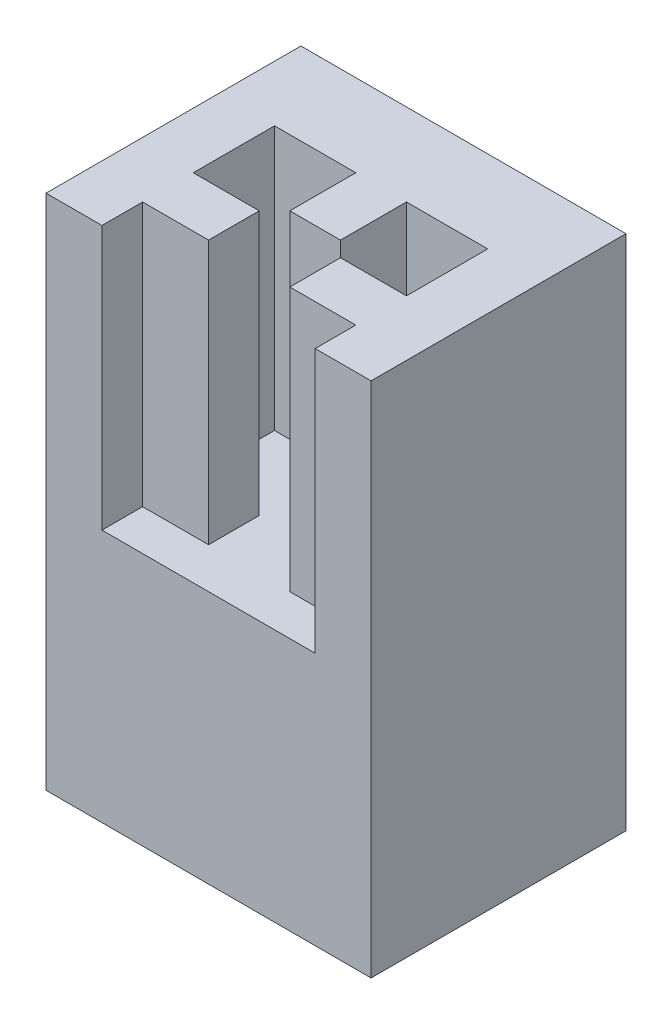
ISO-10303-21;
HEADER;
FILE_DESCRIPTION(('STEP AP214'),'2;1');
FILE_NAME('part.step','',(''),(''),'','','');
FILE_SCHEMA(('AUTOMOTIVE_DESIGN { 1 0 10303 214 1 1 1 1 }'));
ENDSEC;
DATA;
#1=APPLICATION_CONTEXT('core data for automotive mechanical design processes');
#2=APPLICATION_PROTOCOL_DEFINITION('international standard','automotive_design',2000,#1);
#3=PRODUCT_CONTEXT('',#1,'mechanical');
#4=PRODUCT('Part','Part','',(#3));
#5=PRODUCT_RELATED_PRODUCT_CATEGORY('part','',(#4));
#6=PRODUCT_DEFINITION_FORMATION('','',#4);
#7=PRODUCT_DEFINITION_CONTEXT('part definition',#1,'design');
#8=PRODUCT_DEFINITION('design','',#6,#7);
#9=PRODUCT_DEFINITION_SHAPE('','',#8);
#10=(LENGTH_UNIT() NAMED_UNIT(*) SI_UNIT(.MILLI.,.METRE.));
#11=(NAMED_UNIT(*) PLANE_ANGLE_UNIT() SI_UNIT($,.RADIAN.));
#12=(NAMED_UNIT(*) SI_UNIT($,.STERADIAN.) SOLID_ANGLE_UNIT());
#13=UNCERTAINTY_MEASURE_WITH_UNIT(LENGTH_MEASURE(1.E-05),#10,'distance_accuracy_value','');
#14=(GEOMETRIC_REPRESENTATION_CONTEXT(3) GLOBAL_UNCERTAINTY_ASSIGNED_CONTEXT((#13)) GLOBAL_UNIT_ASSIGNED_CONTEXT((#10,
#11,#12)) REPRESENTATION_CONTEXT('',''));
#15=CARTESIAN_POINT('',(0.,0.,0.));
#16=DIRECTION('',(0.,0.,1.));
#17=DIRECTION('',(1.,0.,0.));
#18=AXIS2_PLACEMENT_3D('',#15,#16,#17);
#19=CARTESIAN_POINT('',(0.,49.,0.));
#20=DIRECTION('',(0.,1.,0.));
#21=DIRECTION('',(0.,0.,1.));
#22=AXIS2_PLACEMENT_3D('',#19,#20,#21);
#23=PLANE('',#22);
#24=DIRECTION('',(1.,0.,0.));
#25=VECTOR('',#24,1.);
#26=CARTESIAN_POINT('',(-20.3104790419162,49.,16.4730538922156));
#27=LINE('',#26,#25);
#28=CARTESIAN_POINT('',(-20.3104790419162,49.,16.4730538922156));
#29=VERTEX_POINT('',#28);
#30=CARTESIAN_POINT('',(-14.0604790419162,49.,16.4730538922156));
#31=VERTEX_POINT('',#30);
#32=EDGE_CURVE('E236',#29,#31,#27,.T.);
#33=ORIENTED_EDGE('',*,*,#32,.T.);
#34=DIRECTION('',(0.,0.,1.));
#35=VECTOR('',#34,1.);
#36=CARTESIAN_POINT('',(-14.0604790419162,49.,16.4730538922156));
#37=LINE('',#36,#35);
#38=CARTESIAN_POINT('',(-14.0604790419162,49.,20.3230538922156));
#39=VERTEX_POINT('',#38);
#40=EDGE_CURVE('E234',#31,#39,#37,.T.);
#41=ORIENTED_EDGE('',*,*,#40,.T.);
#42=DIRECTION('',(1.,0.,0.));
#43=VECTOR('',#42,1.);
#44=CARTESIAN_POINT('',(-39.5604790419162,49.,20.3230538922156));
#45=LINE('',#44,#43);
#46=CARTESIAN_POINT('',(-8.76047904191617,49.,20.3230538922156));
#47=VERTEX_POINT('',#46);
#48=EDGE_CURVE('E254',#39,#47,#45,.T.);
#49=ORIENTED_EDGE('',*,*,#48,.T.);
#50=DIRECTION('',(0.,0.,-1.));
#51=VECTOR('',#50,1.);
#52=CARTESIAN_POINT('',(-8.76047904191617,49.,-3.82694610778443));
#53=LINE('',#52,#51);
#54=CARTESIAN_POINT('',(-8.76047904191617,49.,-3.82694610778443));
#55=VERTEX_POINT('',#54);
#56=EDGE_CURVE('E246',#47,#55,#53,.T.);
#57=ORIENTED_EDGE('',*,*,#56,.T.);
#58=DIRECTION('',(-1.,0.,0.));
#59=VECTOR('',#58,1.);
#60=CARTESIAN_POINT('',(-39.5604790419162,49.,-3.82694610778443));
#61=LINE('',#60,#59);
#62=CARTESIAN_POINT('',(-39.5604790419162,49.,-3.82694610778443));
#63=VERTEX_POINT('',#62);
#64=EDGE_CURVE('E249',#55,#63,#61,.T.);
#65=ORIENTED_EDGE('',*,*,#64,.T.);
#66=DIRECTION('',(0.,0.,1.));
#67=VECTOR('',#66,1.);
#68=CARTESIAN_POINT('',(-39.5604790419162,49.,-3.82694610778443));
#69=LINE('',#68,#67);
#70=CARTESIAN_POINT('',(-39.5604790419162,49.,20.3230538922156));
#71=VERTEX_POINT('',#70);
#72=EDGE_CURVE('E252',#63,#71,#69,.T.);
#73=ORIENTED_EDGE('',*,*,#72,.T.);
#74=CARTESIAN_POINT('',(-34.2604790419162,49.,20.3230538922156));
#75=VERTEX_POINT('',#74);
#76=EDGE_CURVE('E255',#71,#75,#45,.T.);
#77=ORIENTED_EDGE('',*,*,#76,.T.);
#78=DIRECTION('',(0.,0.,-1.));
#79=VECTOR('',#78,1.);
#80=CARTESIAN_POINT('',(-34.2604790419162,49.,20.3230538922156));
#81=LINE('',#80,#79);
#82=CARTESIAN_POINT('',(-34.2604790419162,49.,16.4730538922156));
#83=VERTEX_POINT('',#82);
#84=EDGE_CURVE('E245',#75,#83,#81,.T.);
#85=ORIENTED_EDGE('',*,*,#84,.T.);
#86=DIRECTION('',(1.,0.,0.));
#87=VECTOR('',#86,1.);
#88=CARTESIAN_POINT('',(-34.2604790419162,49.,16.4730538922156));
#89=LINE('',#88,#87);
#90=CARTESIAN_POINT('',(-28.0104790419162,49.,16.4730538922156));
#91=VERTEX_POINT('',#90);
#92=EDGE_CURVE('E189',#83,#91,#89,.T.);
#93=ORIENTED_EDGE('',*,*,#92,.T.);
#94=DIRECTION('',(0.,0.,-1.));
#95=VECTOR('',#94,1.);
#96=CARTESIAN_POINT('',(-28.0104790419162,49.,16.4730538922156));
#97=LINE('',#96,#95);
#98=CARTESIAN_POINT('',(-28.0104790419162,49.,11.6730538922156));
#99=VERTEX_POINT('',#98);
#100=EDGE_CURVE('E322',#91,#99,#97,.T.);
#101=ORIENTED_EDGE('',*,*,#100,.T.);
#102=DIRECTION('',(-1.,0.,0.));
#103=VECTOR('',#102,1.);
#104=CARTESIAN_POINT('',(-28.0104790419162,49.,11.6730538922156));
#105=LINE('',#104,#103);
#106=CARTESIAN_POINT('',(-34.2604790419162,49.,11.6730538922156));
#107=VERTEX_POINT('',#106);
#108=EDGE_CURVE('E324',#99,#107,#105,.T.);
#109=ORIENTED_EDGE('',*,*,#108,.T.);
#110=DIRECTION('',(0.,0.,-1.));
#111=VECTOR('',#110,1.);
#112=CARTESIAN_POINT('',(-34.2604790419162,49.,11.6730538922156));
#113=LINE('',#112,#111);
#114=CARTESIAN_POINT('',(-34.2604790419162,49.,3.97305389221557));
#115=VERTEX_POINT('',#114);
#116=EDGE_CURVE('E326',#107,#115,#113,.T.);
#117=ORIENTED_EDGE('',*,*,#116,.T.);
#118=DIRECTION('',(1.,0.,0.));
#119=VECTOR('',#118,1.);
#120=CARTESIAN_POINT('',(-34.2604790419162,49.,3.97305389221557));
#121=LINE('',#120,#119);
#122=CARTESIAN_POINT('',(-26.5604790419162,49.,3.97305389221558));
#123=VERTEX_POINT('',#122);
#124=EDGE_CURVE('E328',#115,#123,#121,.T.);
#125=ORIENTED_EDGE('',*,*,#124,.T.);
#126=DIRECTION('',(0.,0.,1.));
#127=VECTOR('',#126,1.);
#128=CARTESIAN_POINT('',(-26.5604790419162,49.,3.97305389221558));
#129=LINE('',#128,#127);
#130=CARTESIAN_POINT('',(-26.5604790419162,49.,10.2230538922156));
#131=VERTEX_POINT('',#130);
#132=EDGE_CURVE('E330',#123,#131,#129,.T.);
#133=ORIENTED_EDGE('',*,*,#132,.T.);
#134=DIRECTION('',(1.,0.,0.));
#135=VECTOR('',#134,1.);
#136=CARTESIAN_POINT('',(-26.5604790419162,49.,10.2230538922156));
#137=LINE('',#136,#135);
#138=CARTESIAN_POINT('',(-21.7604790419162,49.,10.2230538922156));
#139=VERTEX_POINT('',#138);
#140=EDGE_CURVE('E332',#131,#139,#137,.T.);
#141=ORIENTED_EDGE('',*,*,#140,.T.);
#142=DIRECTION('',(0.,0.,-1.));
#143=VECTOR('',#142,1.);
#144=CARTESIAN_POINT('',(-21.7604790419162,49.,10.2230538922156));
#145=LINE('',#144,#143);
#146=CARTESIAN_POINT('',(-21.7604790419162,49.,3.97305389221557));
#147=VERTEX_POINT('',#146);
#148=EDGE_CURVE('E334',#139,#147,#145,.T.);
#149=ORIENTED_EDGE('',*,*,#148,.T.);
#150=DIRECTION('',(1.,0.,0.));
#151=VECTOR('',#150,1.);
#152=CARTESIAN_POINT('',(-21.7604790419162,49.,3.97305389221557));
#153=LINE('',#152,#151);
#154=CARTESIAN_POINT('',(-14.0604790419162,49.,3.97305389221557));
#155=VERTEX_POINT('',#154);
#156=EDGE_CURVE('E336',#147,#155,#153,.T.);
#157=ORIENTED_EDGE('',*,*,#156,.T.);
#158=DIRECTION('',(0.,0.,1.));
#159=VECTOR('',#158,1.);
#160=CARTESIAN_POINT('',(-14.0604790419162,49.,3.97305389221557));
#161=LINE('',#160,#159);
#162=CARTESIAN_POINT('',(-14.0604790419162,49.,11.6730538922156));
#163=VERTEX_POINT('',#162);
#164=EDGE_CURVE('E338',#155,#163,#161,.T.);
#165=ORIENTED_EDGE('',*,*,#164,.T.);
#166=DIRECTION('',(-1.,0.,0.));
#167=VECTOR('',#166,1.);
#168=CARTESIAN_POINT('',(-14.0604790419162,49.,11.6730538922156));
#169=LINE('',#168,#167);
#170=CARTESIAN_POINT('',(-20.3104790419162,49.,11.6730538922156));
#171=VERTEX_POINT('',#170);
#172=EDGE_CURVE('E340',#163,#171,#169,.T.);
#173=ORIENTED_EDGE('',*,*,#172,.T.);
#174=DIRECTION('',(0.,0.,1.));
#175=VECTOR('',#174,1.);
#176=CARTESIAN_POINT('',(-20.3104790419162,49.,11.6730538922156));
#177=LINE('',#176,#175);
#178=EDGE_CURVE('E342',#171,#29,#177,.T.);
#179=ORIENTED_EDGE('',*,*,#178,.T.);
#180=EDGE_LOOP('',(#33,#41,#49,#57,#65,#73,#77,#85,#93,#101,#109,#117,#125,#133,#141,#149,#157,
#165,#173,#179));
#181=FACE_BOUND('',#180,.T.);
#182=ADVANCED_FACE('F33',(#181),#23,.T.);
#183=CARTESIAN_POINT('',(-8.76047904191617,49.,-3.82694610778443));
#184=DIRECTION('',(-1.,0.,0.));
#185=DIRECTION('',(0.,0.,1.));
#186=AXIS2_PLACEMENT_3D('',#183,#184,#185);
#187=PLANE('',#186);
#188=DIRECTION('',(0.,0.,-1.));
#189=VECTOR('',#188,1.);
#190=CARTESIAN_POINT('',(-8.76047904191617,0.,-3.82694610778443));
#191=LINE('',#190,#189);
#192=CARTESIAN_POINT('',(-8.76047904191617,0.,20.3230538922156));
#193=VERTEX_POINT('',#192);
#194=CARTESIAN_POINT('',(-8.76047904191617,0.,-3.82694610778443));
#195=VERTEX_POINT('',#194);
#196=EDGE_CURVE('E241',#193,#195,#191,.T.);
#197=ORIENTED_EDGE('',*,*,#196,.T.);
#198=DIRECTION('',(0.,-1.,0.));
#199=VECTOR('',#198,1.);
#200=CARTESIAN_POINT('',(-8.76047904191617,49.,-3.82694610778443));
#201=LINE('',#200,#199);
#202=EDGE_CURVE('E11',#55,#195,#201,.T.);
#203=ORIENTED_EDGE('',*,*,#202,.F.);
#204=ORIENTED_EDGE('',*,*,#56,.F.);
#205=DIRECTION('',(0.,-1.,0.));
#206=VECTOR('',#205,1.);
#207=CARTESIAN_POINT('',(-8.76047904191617,49.,20.3230538922156));
#208=LINE('',#207,#206);
#209=EDGE_CURVE('E258',#47,#193,#208,.T.);
#210=ORIENTED_EDGE('',*,*,#209,.T.);
#211=EDGE_LOOP('',(#197,#203,#204,#210));
#212=FACE_BOUND('',#211,.T.);
#213=ADVANCED_FACE('F35',(#212),#187,.F.);
#214=CARTESIAN_POINT('',(-39.5604790419162,49.,-3.82694610778443));
#215=DIRECTION('',(0.,0.,1.));
#216=DIRECTION('',(1.,0.,0.));
#217=AXIS2_PLACEMENT_3D('',#214,#215,#216);
#218=PLANE('',#217);
#219=DIRECTION('',(-1.,0.,0.));
#220=VECTOR('',#219,1.);
#221=CARTESIAN_POINT('',(-39.5604790419162,0.,-3.82694610778443));
#222=LINE('',#221,#220);
#223=CARTESIAN_POINT('',(-39.5604790419162,0.,-3.82694610778443));
#224=VERTEX_POINT('',#223);
#225=EDGE_CURVE('E261',#195,#224,#222,.T.);
#226=ORIENTED_EDGE('',*,*,#225,.T.);
#227=DIRECTION('',(0.,-1.,0.));
#228=VECTOR('',#227,1.);
#229=CARTESIAN_POINT('',(-39.5604790419162,49.,-3.82694610778443));
#230=LINE('',#229,#228);
#231=EDGE_CURVE('E41',#63,#224,#230,.T.);
#232=ORIENTED_EDGE('',*,*,#231,.F.);
#233=ORIENTED_EDGE('',*,*,#64,.F.);
#234=ORIENTED_EDGE('',*,*,#202,.T.);
#235=EDGE_LOOP('',(#226,#232,#233,#234));
#236=FACE_BOUND('',#235,.T.);
#237=ADVANCED_FACE('F413',(#236),#218,.F.);
#238=CARTESIAN_POINT('',(-39.5604790419162,49.,-3.82694610778443));
#239=DIRECTION('',(1.,0.,0.));
#240=DIRECTION('',(0.,0.,-1.));
#241=AXIS2_PLACEMENT_3D('',#238,#239,#240);
#242=PLANE('',#241);
#243=DIRECTION('',(0.,0.,1.));
#244=VECTOR('',#243,1.);
#245=CARTESIAN_POINT('',(-39.5604790419162,0.,-3.82694610778443));
#246=LINE('',#245,#244);
#247=CARTESIAN_POINT('',(-39.5604790419162,0.,20.3230538922156));
#248=VERTEX_POINT('',#247);
#249=EDGE_CURVE('E263',#224,#248,#246,.T.);
#250=ORIENTED_EDGE('',*,*,#249,.T.);
#251=DIRECTION('',(0.,-1.,0.));
#252=VECTOR('',#251,1.);
#253=CARTESIAN_POINT('',(-39.5604790419162,49.,20.3230538922156));
#254=LINE('',#253,#252);
#255=EDGE_CURVE('E268',#71,#248,#254,.T.);
#256=ORIENTED_EDGE('',*,*,#255,.F.);
#257=ORIENTED_EDGE('',*,*,#72,.F.);
#258=ORIENTED_EDGE('',*,*,#231,.T.);
#259=EDGE_LOOP('',(#250,#256,#257,#258));
#260=FACE_BOUND('',#259,.T.);
#261=ADVANCED_FACE('F275',(#260),#242,.F.);
#262=CARTESIAN_POINT('',(-39.5604790419162,49.,20.3230538922156));
#263=DIRECTION('',(0.,0.,-1.));
#264=DIRECTION('',(-1.,0.,0.));
#265=AXIS2_PLACEMENT_3D('',#262,#263,#264);
#266=PLANE('',#265);
#267=ORIENTED_EDGE('',*,*,#48,.F.);
#268=DIRECTION('',(0.,-1.,0.));
#269=VECTOR('',#268,1.);
#270=CARTESIAN_POINT('',(-14.0604790419162,188.640673273356,20.3230538922156));
#271=LINE('',#270,#269);
#272=CARTESIAN_POINT('',(-14.0604790419162,24.,20.3230538922156));
#273=VERTEX_POINT('',#272);
#274=EDGE_CURVE('E48',#39,#273,#271,.T.);
#275=ORIENTED_EDGE('',*,*,#274,.T.);
#276=DIRECTION('',(1.,0.,0.));
#277=VECTOR('',#276,1.);
#278=CARTESIAN_POINT('',(-39.5604790419162,24.,20.3230538922156));
#279=LINE('',#278,#277);
#280=CARTESIAN_POINT('',(-34.2604790419162,24.,20.3230538922156));
#281=VERTEX_POINT('',#280);
#282=EDGE_CURVE('E52',#281,#273,#279,.T.);
#283=ORIENTED_EDGE('',*,*,#282,.F.);
#284=DIRECTION('',(0.,-1.,0.));
#285=VECTOR('',#284,1.);
#286=CARTESIAN_POINT('',(-34.2604790419162,188.640673273356,20.3230538922156));
#287=LINE('',#286,#285);
#288=EDGE_CURVE('E175',#75,#281,#287,.T.);
#289=ORIENTED_EDGE('',*,*,#288,.F.);
#290=ORIENTED_EDGE('',*,*,#76,.F.);
#291=ORIENTED_EDGE('',*,*,#255,.T.);
#292=DIRECTION('',(1.,0.,0.));
#293=VECTOR('',#292,1.);
#294=CARTESIAN_POINT('',(-39.5604790419162,0.,20.3230538922156));
#295=LINE('',#294,#293);
#296=EDGE_CURVE('E250',#248,#193,#295,.T.);
#297=ORIENTED_EDGE('',*,*,#296,.T.);
#298=ORIENTED_EDGE('',*,*,#209,.F.);
#299=EDGE_LOOP('',(#267,#275,#283,#289,#290,#291,#297,#298));
#300=FACE_BOUND('',#299,.T.);
#301=ADVANCED_FACE('F283',(#300),#266,.F.);
#302=CARTESIAN_POINT('',(0.,0.,0.));
#303=DIRECTION('',(0.,1.,0.));
#304=DIRECTION('',(0.,0.,1.));
#305=AXIS2_PLACEMENT_3D('',#302,#303,#304);
#306=PLANE('',#305);
#307=CARTESIAN_POINT('',(-24.1604790419162,0.,8.32305389221557));
#308=DIRECTION('',(0.,-1.,0.));
#309=DIRECTION('',(0.,0.,-1.));
#310=AXIS2_PLACEMENT_3D('',#307,#308,#309);
#311=CIRCLE('',#310,2.75);
#312=CARTESIAN_POINT('',(-24.1604790419162,0.,5.57305389221557));
#313=VERTEX_POINT('',#312);
#314=EDGE_CURVE('E242',#313,#313,#311,.T.);
#315=ORIENTED_EDGE('',*,*,#314,.F.);
#316=EDGE_LOOP('',(#315));
#317=FACE_BOUND('',#316,.T.);
#318=ORIENTED_EDGE('',*,*,#196,.F.);
#319=ORIENTED_EDGE('',*,*,#296,.F.);
#320=ORIENTED_EDGE('',*,*,#249,.F.);
#321=ORIENTED_EDGE('',*,*,#225,.F.);
#322=EDGE_LOOP('',(#318,#319,#320,#321));
#323=FACE_BOUND('',#322,.T.);
#324=ADVANCED_FACE('F281',(#317,#323),#306,.F.);
#325=CARTESIAN_POINT('',(-24.1604790419162,22.,8.32305389221557));
#326=DIRECTION('',(0.,-1.,0.));
#327=DIRECTION('',(0.,0.,-1.));
#328=AXIS2_PLACEMENT_3D('',#325,#326,#327);
#329=CYLINDRICAL_SURFACE('',#328,2.75);
#330=CARTESIAN_POINT('',(-24.1604790419162,22.,8.32305389221557));
#331=DIRECTION('',(0.,-1.,0.));
#332=DIRECTION('',(0.,0.,-1.));
#333=AXIS2_PLACEMENT_3D('',#330,#331,#332);
#334=CIRCLE('',#333,2.75);
#335=CARTESIAN_POINT('',(-24.1604790419162,22.,5.57305389221557));
#336=VERTEX_POINT('',#335);
#337=EDGE_CURVE('E238',#336,#336,#334,.T.);
#338=ORIENTED_EDGE('',*,*,#337,.F.);
#339=EDGE_LOOP('',(#338));
#340=FACE_BOUND('',#339,.T.);
#341=ORIENTED_EDGE('',*,*,#314,.T.);
#342=EDGE_LOOP('',(#341));
#343=FACE_BOUND('',#342,.T.);
#344=ADVANCED_FACE('F416',(#340,#343),#329,.F.);
#345=CARTESIAN_POINT('',(-24.1604790419162,22.,8.32305389221557));
#346=DIRECTION('',(0.,-1.,0.));
#347=DIRECTION('',(0.,0.,-1.));
#348=AXIS2_PLACEMENT_3D('',#345,#346,#347);
#349=PLANE('',#348);
#350=ORIENTED_EDGE('',*,*,#337,.T.);
#351=EDGE_LOOP('',(#350));
#352=FACE_BOUND('',#351,.T.);
#353=ADVANCED_FACE('F448',(#352),#349,.T.);
#354=CARTESIAN_POINT('',(-14.0604790419162,188.640673273356,16.4730538922156));
#355=DIRECTION('',(1.,0.,0.));
#356=DIRECTION('',(0.,0.,-1.));
#357=AXIS2_PLACEMENT_3D('',#354,#355,#356);
#358=PLANE('',#357);
#359=DIRECTION('',(0.,-1.,0.));
#360=VECTOR('',#359,1.);
#361=CARTESIAN_POINT('',(-14.0604790419162,188.640673273356,16.4730538922156));
#362=LINE('',#361,#360);
#363=CARTESIAN_POINT('',(-14.0604790419162,24.,16.4730538922156));
#364=VERTEX_POINT('',#363);
#365=EDGE_CURVE('E231',#31,#364,#362,.T.);
#366=ORIENTED_EDGE('',*,*,#365,.T.);
#367=DIRECTION('',(0.,0.,1.));
#368=VECTOR('',#367,1.);
#369=CARTESIAN_POINT('',(-14.0604790419162,24.,16.4730538922156));
#370=LINE('',#369,#368);
#371=EDGE_CURVE('E194',#364,#273,#370,.T.);
#372=ORIENTED_EDGE('',*,*,#371,.T.);
#373=ORIENTED_EDGE('',*,*,#274,.F.);
#374=ORIENTED_EDGE('',*,*,#40,.F.);
#375=EDGE_LOOP('',(#366,#372,#373,#374));
#376=FACE_BOUND('',#375,.T.);
#377=ADVANCED_FACE('F292',(#376),#358,.F.);
#378=CARTESIAN_POINT('',(-20.3104790419162,188.640673273356,16.4730538922156));
#379=DIRECTION('',(0.,0.,-1.));
#380=DIRECTION('',(-1.,0.,0.));
#381=AXIS2_PLACEMENT_3D('',#378,#379,#380);
#382=PLANE('',#381);
#383=DIRECTION('',(0.,-1.,0.));
#384=VECTOR('',#383,1.);
#385=CARTESIAN_POINT('',(-20.3104790419162,188.640673273356,16.4730538922156));
#386=LINE('',#385,#384);
#387=CARTESIAN_POINT('',(-20.3104790419162,24.,16.4730538922156));
#388=VERTEX_POINT('',#387);
#389=EDGE_CURVE('E227',#29,#388,#386,.T.);
#390=ORIENTED_EDGE('',*,*,#389,.T.);
#391=DIRECTION('',(1.,0.,0.));
#392=VECTOR('',#391,1.);
#393=CARTESIAN_POINT('',(-20.3104790419162,24.,16.4730538922156));
#394=LINE('',#393,#392);
#395=EDGE_CURVE('E296',#388,#364,#394,.T.);
#396=ORIENTED_EDGE('',*,*,#395,.T.);
#397=ORIENTED_EDGE('',*,*,#365,.F.);
#398=ORIENTED_EDGE('',*,*,#32,.F.);
#399=EDGE_LOOP('',(#390,#396,#397,#398));
#400=FACE_BOUND('',#399,.T.);
#401=ADVANCED_FACE('F348',(#400),#382,.F.);
#402=CARTESIAN_POINT('',(-20.3104790419162,188.640673273356,11.6730538922156));
#403=DIRECTION('',(1.,0.,0.));
#404=DIRECTION('',(0.,0.,-1.));
#405=AXIS2_PLACEMENT_3D('',#402,#403,#404);
#406=PLANE('',#405);
#407=DIRECTION('',(0.,-1.,0.));
#408=VECTOR('',#407,1.);
#409=CARTESIAN_POINT('',(-20.3104790419162,188.640673273356,11.6730538922156));
#410=LINE('',#409,#408);
#411=CARTESIAN_POINT('',(-20.3104790419162,24.,11.6730538922156));
#412=VERTEX_POINT('',#411);
#413=EDGE_CURVE('E224',#171,#412,#410,.T.);
#414=ORIENTED_EDGE('',*,*,#413,.T.);
#415=DIRECTION('',(0.,0.,1.));
#416=VECTOR('',#415,1.);
#417=CARTESIAN_POINT('',(-20.3104790419162,24.,11.6730538922156));
#418=LINE('',#417,#416);
#419=EDGE_CURVE('E297',#412,#388,#418,.T.);
#420=ORIENTED_EDGE('',*,*,#419,.T.);
#421=ORIENTED_EDGE('',*,*,#389,.F.);
#422=ORIENTED_EDGE('',*,*,#178,.F.);
#423=EDGE_LOOP('',(#414,#420,#421,#422));
#424=FACE_BOUND('',#423,.T.);
#425=ADVANCED_FACE('F350',(#424),#406,.F.);
#426=CARTESIAN_POINT('',(-14.0604790419162,188.640673273356,11.6730538922156));
#427=DIRECTION('',(0.,0.,1.));
#428=DIRECTION('',(1.,0.,0.));
#429=AXIS2_PLACEMENT_3D('',#426,#427,#428);
#430=PLANE('',#429);
#431=DIRECTION('',(0.,-1.,0.));
#432=VECTOR('',#431,1.);
#433=CARTESIAN_POINT('',(-14.0604790419162,188.640673273356,11.6730538922156));
#434=LINE('',#433,#432);
#435=CARTESIAN_POINT('',(-14.0604790419162,24.,11.6730538922156));
#436=VERTEX_POINT('',#435);
#437=EDGE_CURVE('E221',#163,#436,#434,.T.);
#438=ORIENTED_EDGE('',*,*,#437,.T.);
#439=DIRECTION('',(-1.,0.,0.));
#440=VECTOR('',#439,1.);
#441=CARTESIAN_POINT('',(-14.0604790419162,24.,11.6730538922156));
#442=LINE('',#441,#440);
#443=EDGE_CURVE('E301',#436,#412,#442,.T.);
#444=ORIENTED_EDGE('',*,*,#443,.T.);
#445=ORIENTED_EDGE('',*,*,#413,.F.);
#446=ORIENTED_EDGE('',*,*,#172,.F.);
#447=EDGE_LOOP('',(#438,#444,#445,#446));
#448=FACE_BOUND('',#447,.T.);
#449=ADVANCED_FACE('F359',(#448),#430,.F.);
#450=CARTESIAN_POINT('',(-14.0604790419162,188.640673273356,3.97305389221557));
#451=DIRECTION('',(1.,0.,0.));
#452=DIRECTION('',(0.,0.,-1.));
#453=AXIS2_PLACEMENT_3D('',#450,#451,#452);
#454=PLANE('',#453);
#455=DIRECTION('',(0.,-1.,0.));
#456=VECTOR('',#455,1.);
#457=CARTESIAN_POINT('',(-14.0604790419162,188.640673273356,3.97305389221557));
#458=LINE('',#457,#456);
#459=CARTESIAN_POINT('',(-14.0604790419162,24.,3.97305389221557));
#460=VERTEX_POINT('',#459);
#461=EDGE_CURVE('E218',#155,#460,#458,.T.);
#462=ORIENTED_EDGE('',*,*,#461,.T.);
#463=DIRECTION('',(0.,0.,1.));
#464=VECTOR('',#463,1.);
#465=CARTESIAN_POINT('',(-14.0604790419162,24.,3.97305389221557));
#466=LINE('',#465,#464);
#467=EDGE_CURVE('E303',#460,#436,#466,.T.);
#468=ORIENTED_EDGE('',*,*,#467,.T.);
#469=ORIENTED_EDGE('',*,*,#437,.F.);
#470=ORIENTED_EDGE('',*,*,#164,.F.);
#471=EDGE_LOOP('',(#462,#468,#469,#470));
#472=FACE_BOUND('',#471,.T.);
#473=ADVANCED_FACE('F362',(#472),#454,.F.);
#474=CARTESIAN_POINT('',(-21.7604790419162,188.640673273356,3.97305389221557));
#475=DIRECTION('',(0.,0.,-1.));
#476=DIRECTION('',(-1.,0.,0.));
#477=AXIS2_PLACEMENT_3D('',#474,#475,#476);
#478=PLANE('',#477);
#479=DIRECTION('',(0.,-1.,0.));
#480=VECTOR('',#479,1.);
#481=CARTESIAN_POINT('',(-21.7604790419162,188.640673273356,3.97305389221557));
#482=LINE('',#481,#480);
#483=CARTESIAN_POINT('',(-21.7604790419162,24.,3.97305389221557));
#484=VERTEX_POINT('',#483);
#485=EDGE_CURVE('E215',#147,#484,#482,.T.);
#486=ORIENTED_EDGE('',*,*,#485,.T.);
#487=DIRECTION('',(1.,0.,0.));
#488=VECTOR('',#487,1.);
#489=CARTESIAN_POINT('',(-21.7604790419162,24.,3.97305389221557));
#490=LINE('',#489,#488);
#491=EDGE_CURVE('E305',#484,#460,#490,.T.);
#492=ORIENTED_EDGE('',*,*,#491,.T.);
#493=ORIENTED_EDGE('',*,*,#461,.F.);
#494=ORIENTED_EDGE('',*,*,#156,.F.);
#495=EDGE_LOOP('',(#486,#492,#493,#494));
#496=FACE_BOUND('',#495,.T.);
#497=ADVANCED_FACE('F366',(#496),#478,.F.);
#498=CARTESIAN_POINT('',(-21.7604790419162,188.640673273356,10.2230538922156));
#499=DIRECTION('',(-1.,0.,0.));
#500=DIRECTION('',(0.,0.,1.));
#501=AXIS2_PLACEMENT_3D('',#498,#499,#500);
#502=PLANE('',#501);
#503=DIRECTION('',(0.,-1.,0.));
#504=VECTOR('',#503,1.);
#505=CARTESIAN_POINT('',(-21.7604790419162,188.640673273356,10.2230538922156));
#506=LINE('',#505,#504);
#507=CARTESIAN_POINT('',(-21.7604790419162,24.,10.2230538922156));
#508=VERTEX_POINT('',#507);
#509=EDGE_CURVE('E212',#139,#508,#506,.T.);
#510=ORIENTED_EDGE('',*,*,#509,.T.);
#511=DIRECTION('',(0.,0.,-1.));
#512=VECTOR('',#511,1.);
#513=CARTESIAN_POINT('',(-21.7604790419162,24.,10.2230538922156));
#514=LINE('',#513,#512);
#515=EDGE_CURVE('E307',#508,#484,#514,.T.);
#516=ORIENTED_EDGE('',*,*,#515,.T.);
#517=ORIENTED_EDGE('',*,*,#485,.F.);
#518=ORIENTED_EDGE('',*,*,#148,.F.);
#519=EDGE_LOOP('',(#510,#516,#517,#518));
#520=FACE_BOUND('',#519,.T.);
#521=ADVANCED_FACE('F374',(#520),#502,.F.);
#522=CARTESIAN_POINT('',(-26.5604790419162,188.640673273356,10.2230538922156));
#523=DIRECTION('',(0.,0.,-1.));
#524=DIRECTION('',(-1.,0.,0.));
#525=AXIS2_PLACEMENT_3D('',#522,#523,#524);
#526=PLANE('',#525);
#527=DIRECTION('',(0.,-1.,0.));
#528=VECTOR('',#527,1.);
#529=CARTESIAN_POINT('',(-26.5604790419162,188.640673273356,10.2230538922156));
#530=LINE('',#529,#528);
#531=CARTESIAN_POINT('',(-26.5604790419162,24.,10.2230538922156));
#532=VERTEX_POINT('',#531);
#533=EDGE_CURVE('E209',#131,#532,#530,.T.);
#534=ORIENTED_EDGE('',*,*,#533,.T.);
#535=DIRECTION('',(1.,0.,0.));
#536=VECTOR('',#535,1.);
#537=CARTESIAN_POINT('',(-26.5604790419162,24.,10.2230538922156));
#538=LINE('',#537,#536);
#539=EDGE_CURVE('E309',#532,#508,#538,.T.);
#540=ORIENTED_EDGE('',*,*,#539,.T.);
#541=ORIENTED_EDGE('',*,*,#509,.F.);
#542=ORIENTED_EDGE('',*,*,#140,.F.);
#543=EDGE_LOOP('',(#534,#540,#541,#542));
#544=FACE_BOUND('',#543,.T.);
#545=ADVANCED_FACE('F377',(#544),#526,.F.);
#546=CARTESIAN_POINT('',(-26.5604790419162,188.640673273356,3.97305389221558));
#547=DIRECTION('',(1.,0.,0.));
#548=DIRECTION('',(0.,0.,-1.));
#549=AXIS2_PLACEMENT_3D('',#546,#547,#548);
#550=PLANE('',#549);
#551=DIRECTION('',(0.,-1.,0.));
#552=VECTOR('',#551,1.);
#553=CARTESIAN_POINT('',(-26.5604790419162,188.640673273356,3.97305389221558));
#554=LINE('',#553,#552);
#555=CARTESIAN_POINT('',(-26.5604790419162,24.,3.97305389221558));
#556=VERTEX_POINT('',#555);
#557=EDGE_CURVE('E206',#123,#556,#554,.T.);
#558=ORIENTED_EDGE('',*,*,#557,.T.);
#559=DIRECTION('',(0.,0.,1.));
#560=VECTOR('',#559,1.);
#561=CARTESIAN_POINT('',(-26.5604790419162,24.,3.97305389221558));
#562=LINE('',#561,#560);
#563=EDGE_CURVE('E311',#556,#532,#562,.T.);
#564=ORIENTED_EDGE('',*,*,#563,.T.);
#565=ORIENTED_EDGE('',*,*,#533,.F.);
#566=ORIENTED_EDGE('',*,*,#132,.F.);
#567=EDGE_LOOP('',(#558,#564,#565,#566));
#568=FACE_BOUND('',#567,.T.);
#569=ADVANCED_FACE('F381',(#568),#550,.F.);
#570=CARTESIAN_POINT('',(-34.2604790419162,188.640673273356,3.97305389221557));
#571=DIRECTION('',(0.,0.,-1.));
#572=DIRECTION('',(-1.,0.,0.));
#573=AXIS2_PLACEMENT_3D('',#570,#571,#572);
#574=PLANE('',#573);
#575=DIRECTION('',(0.,-1.,0.));
#576=VECTOR('',#575,1.);
#577=CARTESIAN_POINT('',(-34.2604790419162,188.640673273356,3.97305389221557));
#578=LINE('',#577,#576);
#579=CARTESIAN_POINT('',(-34.2604790419162,24.,3.97305389221557));
#580=VERTEX_POINT('',#579);
#581=EDGE_CURVE('E203',#115,#580,#578,.T.);
#582=ORIENTED_EDGE('',*,*,#581,.T.);
#583=DIRECTION('',(1.,0.,0.));
#584=VECTOR('',#583,1.);
#585=CARTESIAN_POINT('',(-34.2604790419162,24.,3.97305389221557));
#586=LINE('',#585,#584);
#587=EDGE_CURVE('E313',#580,#556,#586,.T.);
#588=ORIENTED_EDGE('',*,*,#587,.T.);
#589=ORIENTED_EDGE('',*,*,#557,.F.);
#590=ORIENTED_EDGE('',*,*,#124,.F.);
#591=EDGE_LOOP('',(#582,#588,#589,#590));
#592=FACE_BOUND('',#591,.T.);
#593=ADVANCED_FACE('F388',(#592),#574,.F.);
#594=CARTESIAN_POINT('',(-34.2604790419162,188.640673273356,11.6730538922156));
#595=DIRECTION('',(-1.,0.,0.));
#596=DIRECTION('',(0.,0.,1.));
#597=AXIS2_PLACEMENT_3D('',#594,#595,#596);
#598=PLANE('',#597);
#599=DIRECTION('',(0.,-1.,0.));
#600=VECTOR('',#599,1.);
#601=CARTESIAN_POINT('',(-34.2604790419162,188.640673273356,11.6730538922156));
#602=LINE('',#601,#600);
#603=CARTESIAN_POINT('',(-34.2604790419162,24.,11.6730538922156));
#604=VERTEX_POINT('',#603);
#605=EDGE_CURVE('E200',#107,#604,#602,.T.);
#606=ORIENTED_EDGE('',*,*,#605,.T.);
#607=DIRECTION('',(0.,0.,-1.));
#608=VECTOR('',#607,1.);
#609=CARTESIAN_POINT('',(-34.2604790419162,24.,11.6730538922156));
#610=LINE('',#609,#608);
#611=EDGE_CURVE('E315',#604,#580,#610,.T.);
#612=ORIENTED_EDGE('',*,*,#611,.T.);
#613=ORIENTED_EDGE('',*,*,#581,.F.);
#614=ORIENTED_EDGE('',*,*,#116,.F.);
#615=EDGE_LOOP('',(#606,#612,#613,#614));
#616=FACE_BOUND('',#615,.T.);
#617=ADVANCED_FACE('F391',(#616),#598,.F.);
#618=CARTESIAN_POINT('',(-28.0104790419162,188.640673273356,11.6730538922156));
#619=DIRECTION('',(0.,0.,1.));
#620=DIRECTION('',(1.,0.,0.));
#621=AXIS2_PLACEMENT_3D('',#618,#619,#620);
#622=PLANE('',#621);
#623=DIRECTION('',(0.,-1.,0.));
#624=VECTOR('',#623,1.);
#625=CARTESIAN_POINT('',(-28.0104790419162,188.640673273356,11.6730538922156));
#626=LINE('',#625,#624);
#627=CARTESIAN_POINT('',(-28.0104790419162,24.,11.6730538922156));
#628=VERTEX_POINT('',#627);
#629=EDGE_CURVE('E192',#99,#628,#626,.T.);
#630=ORIENTED_EDGE('',*,*,#629,.T.);
#631=DIRECTION('',(-1.,0.,0.));
#632=VECTOR('',#631,1.);
#633=CARTESIAN_POINT('',(-28.0104790419162,24.,11.6730538922156));
#634=LINE('',#633,#632);
#635=EDGE_CURVE('E317',#628,#604,#634,.T.);
#636=ORIENTED_EDGE('',*,*,#635,.T.);
#637=ORIENTED_EDGE('',*,*,#605,.F.);
#638=ORIENTED_EDGE('',*,*,#108,.F.);
#639=EDGE_LOOP('',(#630,#636,#637,#638));
#640=FACE_BOUND('',#639,.T.);
#641=ADVANCED_FACE('F395',(#640),#622,.F.);
#642=CARTESIAN_POINT('',(-28.0104790419162,188.640673273356,16.4730538922156));
#643=DIRECTION('',(-1.,0.,0.));
#644=DIRECTION('',(0.,0.,1.));
#645=AXIS2_PLACEMENT_3D('',#642,#643,#644);
#646=PLANE('',#645);
#647=DIRECTION('',(0.,-1.,0.));
#648=VECTOR('',#647,1.);
#649=CARTESIAN_POINT('',(-28.0104790419162,188.640673273356,16.4730538922156));
#650=LINE('',#649,#648);
#651=CARTESIAN_POINT('',(-28.0104790419162,24.,16.4730538922156));
#652=VERTEX_POINT('',#651);
#653=EDGE_CURVE('E190',#91,#652,#650,.T.);
#654=ORIENTED_EDGE('',*,*,#653,.T.);
#655=DIRECTION('',(0.,0.,-1.));
#656=VECTOR('',#655,1.);
#657=CARTESIAN_POINT('',(-28.0104790419162,24.,16.4730538922156));
#658=LINE('',#657,#656);
#659=EDGE_CURVE('E182',#652,#628,#658,.T.);
#660=ORIENTED_EDGE('',*,*,#659,.T.);
#661=ORIENTED_EDGE('',*,*,#629,.F.);
#662=ORIENTED_EDGE('',*,*,#100,.F.);
#663=EDGE_LOOP('',(#654,#660,#661,#662));
#664=FACE_BOUND('',#663,.T.);
#665=ADVANCED_FACE('F399',(#664),#646,.F.);
#666=CARTESIAN_POINT('',(-34.2604790419162,188.640673273356,16.4730538922156));
#667=DIRECTION('',(0.,0.,-1.));
#668=DIRECTION('',(-1.,0.,0.));
#669=AXIS2_PLACEMENT_3D('',#666,#667,#668);
#670=PLANE('',#669);
#671=DIRECTION('',(0.,-1.,0.));
#672=VECTOR('',#671,1.);
#673=CARTESIAN_POINT('',(-34.2604790419162,188.640673273356,16.4730538922156));
#674=LINE('',#673,#672);
#675=CARTESIAN_POINT('',(-34.2604790419162,24.,16.4730538922156));
#676=VERTEX_POINT('',#675);
#677=EDGE_CURVE('E174',#83,#676,#674,.T.);
#678=ORIENTED_EDGE('',*,*,#677,.T.);
#679=DIRECTION('',(1.,0.,0.));
#680=VECTOR('',#679,1.);
#681=CARTESIAN_POINT('',(-34.2604790419162,24.,16.4730538922156));
#682=LINE('',#681,#680);
#683=EDGE_CURVE('E177',#676,#652,#682,.T.);
#684=ORIENTED_EDGE('',*,*,#683,.T.);
#685=ORIENTED_EDGE('',*,*,#653,.F.);
#686=ORIENTED_EDGE('',*,*,#92,.F.);
#687=EDGE_LOOP('',(#678,#684,#685,#686));
#688=FACE_BOUND('',#687,.T.);
#689=ADVANCED_FACE('F188',(#688),#670,.F.);
#690=CARTESIAN_POINT('',(-34.2604790419162,188.640673273356,20.3230538922156));
#691=DIRECTION('',(-1.,0.,0.));
#692=DIRECTION('',(0.,0.,1.));
#693=AXIS2_PLACEMENT_3D('',#690,#691,#692);
#694=PLANE('',#693);
#695=ORIENTED_EDGE('',*,*,#288,.T.);
#696=DIRECTION('',(0.,0.,-1.));
#697=VECTOR('',#696,1.);
#698=CARTESIAN_POINT('',(-34.2604790419162,24.,20.3230538922156));
#699=LINE('',#698,#697);
#700=EDGE_CURVE('E169',#281,#676,#699,.T.);
#701=ORIENTED_EDGE('',*,*,#700,.T.);
#702=ORIENTED_EDGE('',*,*,#677,.F.);
#703=ORIENTED_EDGE('',*,*,#84,.F.);
#704=EDGE_LOOP('',(#695,#701,#702,#703));
#705=FACE_BOUND('',#704,.T.);
#706=ADVANCED_FACE('F171',(#705),#694,.F.);
#707=CARTESIAN_POINT('',(0.,24.,0.));
#708=DIRECTION('',(0.,1.,0.));
#709=DIRECTION('',(0.,0.,1.));
#710=AXIS2_PLACEMENT_3D('',#707,#708,#709);
#711=PLANE('',#710);
#712=ORIENTED_EDGE('',*,*,#683,.F.);
#713=ORIENTED_EDGE('',*,*,#700,.F.);
#714=ORIENTED_EDGE('',*,*,#282,.T.);
#715=ORIENTED_EDGE('',*,*,#371,.F.);
#716=ORIENTED_EDGE('',*,*,#395,.F.);
#717=ORIENTED_EDGE('',*,*,#419,.F.);
#718=ORIENTED_EDGE('',*,*,#443,.F.);
#719=ORIENTED_EDGE('',*,*,#467,.F.);
#720=ORIENTED_EDGE('',*,*,#491,.F.);
#721=ORIENTED_EDGE('',*,*,#515,.F.);
#722=ORIENTED_EDGE('',*,*,#539,.F.);
#723=ORIENTED_EDGE('',*,*,#563,.F.);
#724=ORIENTED_EDGE('',*,*,#587,.F.);
#725=ORIENTED_EDGE('',*,*,#611,.F.);
#726=ORIENTED_EDGE('',*,*,#635,.F.);
#727=ORIENTED_EDGE('',*,*,#659,.F.);
#728=EDGE_LOOP('',(#712,#713,#714,#715,#716,#717,#718,#719,#720,#721,#722,#723,#724,#725,#726,#727));
#729=FACE_BOUND('',#728,.T.);
#730=ADVANCED_FACE('F180',(#729),#711,.T.);
#731=CLOSED_SHELL('',(#182,#213,#237,#261,#301,#324,#344,#353,#377,#401,#425,#449,#473,#497,
#521,#545,#569,#593,#617,#641,#665,#689,#706,#730));
#732=MANIFOLD_SOLID_BREP('B2',#731);
#733=ADVANCED_BREP_SHAPE_REPRESENTATION('',(#18,#732),#14);
#734=SHAPE_DEFINITION_REPRESENTATION(#9,#733);
ENDSEC;
END-ISO-10303-21;
